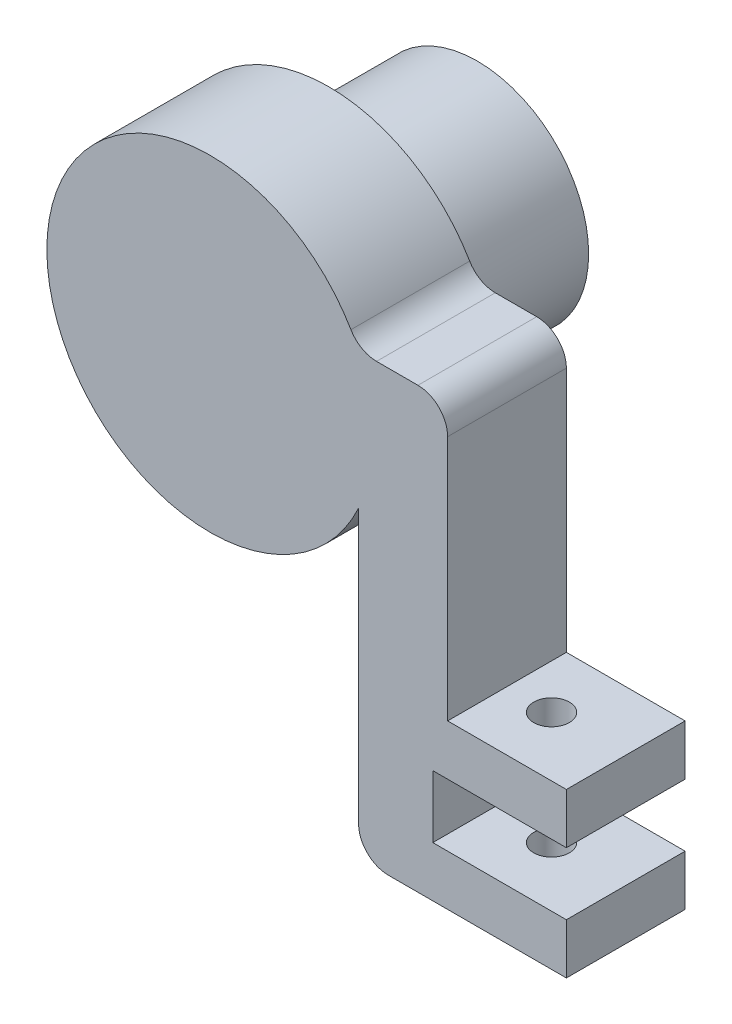
ISO-10303-21;
HEADER;
FILE_DESCRIPTION(('STEP AP214'),'2;1');
FILE_NAME('part.step','',(''),(''),'','','');
FILE_SCHEMA(('AUTOMOTIVE_DESIGN { 1 0 10303 214 1 1 1 1 }'));
ENDSEC;
DATA;
#1=APPLICATION_CONTEXT('core data for automotive mechanical design processes');
#2=APPLICATION_PROTOCOL_DEFINITION('international standard','automotive_design',2000,#1);
#3=PRODUCT_CONTEXT('',#1,'mechanical');
#4=PRODUCT('Part','Part','',(#3));
#5=PRODUCT_RELATED_PRODUCT_CATEGORY('part','',(#4));
#6=PRODUCT_DEFINITION_FORMATION('','',#4);
#7=PRODUCT_DEFINITION_CONTEXT('part definition',#1,'design');
#8=PRODUCT_DEFINITION('design','',#6,#7);
#9=PRODUCT_DEFINITION_SHAPE('','',#8);
#10=(LENGTH_UNIT() NAMED_UNIT(*) SI_UNIT(.MILLI.,.METRE.));
#11=(NAMED_UNIT(*) PLANE_ANGLE_UNIT() SI_UNIT($,.RADIAN.));
#12=(NAMED_UNIT(*) SI_UNIT($,.STERADIAN.) SOLID_ANGLE_UNIT());
#13=UNCERTAINTY_MEASURE_WITH_UNIT(LENGTH_MEASURE(1.E-05),#10,'distance_accuracy_value','');
#14=(GEOMETRIC_REPRESENTATION_CONTEXT(3) GLOBAL_UNCERTAINTY_ASSIGNED_CONTEXT((#13)) GLOBAL_UNIT_ASSIGNED_CONTEXT((#10,
#11,#12)) REPRESENTATION_CONTEXT('',''));
#15=CARTESIAN_POINT('',(0.,0.,0.));
#16=DIRECTION('',(0.,0.,1.));
#17=DIRECTION('',(1.,0.,0.));
#18=AXIS2_PLACEMENT_3D('',#15,#16,#17);
#19=CARTESIAN_POINT('',(35.,-36.,8.));
#20=DIRECTION('',(0.,1.,0.));
#21=DIRECTION('',(0.,0.,1.));
#22=AXIS2_PLACEMENT_3D('',#19,#20,#21);
#23=PLANE('',#22);
#24=DIRECTION('',(1.,0.,0.));
#25=VECTOR('',#24,1.);
#26=CARTESIAN_POINT('',(35.,-36.,8.));
#27=LINE('',#26,#25);
#28=CARTESIAN_POINT('',(23.,-36.,8.));
#29=VERTEX_POINT('',#28);
#30=CARTESIAN_POINT('',(35.,-36.,8.));
#31=VERTEX_POINT('',#30);
#32=EDGE_CURVE('E159',#29,#31,#27,.T.);
#33=ORIENTED_EDGE('',*,*,#32,.F.);
#34=DIRECTION('',(0.,0.,-1.));
#35=VECTOR('',#34,1.);
#36=CARTESIAN_POINT('',(23.,-36.,8.));
#37=LINE('',#36,#35);
#38=CARTESIAN_POINT('',(23.,-36.,0.));
#39=VERTEX_POINT('',#38);
#40=EDGE_CURVE('E170',#29,#39,#37,.T.);
#41=ORIENTED_EDGE('',*,*,#40,.T.);
#42=DIRECTION('',(1.,0.,0.));
#43=VECTOR('',#42,1.);
#44=CARTESIAN_POINT('',(35.,-36.,0.));
#45=LINE('',#44,#43);
#46=CARTESIAN_POINT('',(35.,-36.,0.));
#47=VERTEX_POINT('',#46);
#48=EDGE_CURVE('E164',#39,#47,#45,.T.);
#49=ORIENTED_EDGE('',*,*,#48,.T.);
#50=DIRECTION('',(0.,0.,-1.));
#51=VECTOR('',#50,1.);
#52=CARTESIAN_POINT('',(35.,-36.,8.));
#53=LINE('',#52,#51);
#54=EDGE_CURVE('E247',#31,#47,#53,.T.);
#55=ORIENTED_EDGE('',*,*,#54,.F.);
#56=EDGE_LOOP('',(#33,#41,#49,#55));
#57=FACE_BOUND('',#56,.T.);
#58=CARTESIAN_POINT('',(30.,-36.,4.));
#59=DIRECTION('',(0.,1.,0.));
#60=DIRECTION('',(0.,0.,1.));
#61=AXIS2_PLACEMENT_3D('',#58,#59,#60);
#62=CIRCLE('',#61,1.19999999999999);
#63=CARTESIAN_POINT('',(30.,-36.,5.19999999999999));
#64=VERTEX_POINT('',#63);
#65=EDGE_CURVE('E335',#64,#64,#62,.F.);
#66=ORIENTED_EDGE('',*,*,#65,.F.);
#67=EDGE_LOOP('',(#66));
#68=FACE_BOUND('',#67,.T.);
#69=ADVANCED_FACE('F39',(#57,#68),#23,.F.);
#70=CARTESIAN_POINT('',(35.,-36.,8.));
#71=DIRECTION('',(-1.,0.,0.));
#72=DIRECTION('',(0.,0.,1.));
#73=AXIS2_PLACEMENT_3D('',#70,#71,#72);
#74=PLANE('',#73);
#75=DIRECTION('',(0.,1.,0.));
#76=VECTOR('',#75,1.);
#77=CARTESIAN_POINT('',(35.,-36.,0.));
#78=LINE('',#77,#76);
#79=CARTESIAN_POINT('',(35.,-32.6,0.));
#80=VERTEX_POINT('',#79);
#81=EDGE_CURVE('E168',#47,#80,#78,.T.);
#82=ORIENTED_EDGE('',*,*,#81,.T.);
#83=DIRECTION('',(0.,0.,-1.));
#84=VECTOR('',#83,1.);
#85=CARTESIAN_POINT('',(35.,-32.6,8.));
#86=LINE('',#85,#84);
#87=CARTESIAN_POINT('',(35.,-32.6,8.));
#88=VERTEX_POINT('',#87);
#89=EDGE_CURVE('E146',#88,#80,#86,.T.);
#90=ORIENTED_EDGE('',*,*,#89,.F.);
#91=DIRECTION('',(0.,1.,0.));
#92=VECTOR('',#91,1.);
#93=CARTESIAN_POINT('',(35.,-36.,8.));
#94=LINE('',#93,#92);
#95=EDGE_CURVE('E153',#31,#88,#94,.T.);
#96=ORIENTED_EDGE('',*,*,#95,.F.);
#97=ORIENTED_EDGE('',*,*,#54,.T.);
#98=EDGE_LOOP('',(#82,#90,#96,#97));
#99=FACE_BOUND('',#98,.T.);
#100=ADVANCED_FACE('F166',(#99),#74,.F.);
#101=CARTESIAN_POINT('',(35.,-32.6,8.));
#102=DIRECTION('',(0.,-1.,0.));
#103=DIRECTION('',(1.,0.,0.));
#104=AXIS2_PLACEMENT_3D('',#101,#102,#103);
#105=PLANE('',#104);
#106=CARTESIAN_POINT('',(30.,-32.6,4.));
#107=DIRECTION('',(0.,-1.,0.));
#108=DIRECTION('',(1.,0.,0.));
#109=AXIS2_PLACEMENT_3D('',#106,#107,#108);
#110=CIRCLE('',#109,1.19999999999999);
#111=CARTESIAN_POINT('',(31.2,-32.6,4.));
#112=VERTEX_POINT('',#111);
#113=EDGE_CURVE('E251',#112,#112,#110,.T.);
#114=ORIENTED_EDGE('',*,*,#113,.T.);
#115=EDGE_LOOP('',(#114));
#116=FACE_BOUND('',#115,.T.);
#117=DIRECTION('',(-1.,0.,0.));
#118=VECTOR('',#117,1.);
#119=CARTESIAN_POINT('',(35.,-32.6,0.));
#120=LINE('',#119,#118);
#121=CARTESIAN_POINT('',(26.,-32.6,0.));
#122=VERTEX_POINT('',#121);
#123=EDGE_CURVE('E250',#80,#122,#120,.T.);
#124=ORIENTED_EDGE('',*,*,#123,.T.);
#125=DIRECTION('',(0.,0.,-1.));
#126=VECTOR('',#125,1.);
#127=CARTESIAN_POINT('',(26.,-32.6,8.));
#128=LINE('',#127,#126);
#129=CARTESIAN_POINT('',(26.,-32.6,8.));
#130=VERTEX_POINT('',#129);
#131=EDGE_CURVE('E149',#130,#122,#128,.T.);
#132=ORIENTED_EDGE('',*,*,#131,.F.);
#133=DIRECTION('',(-1.,0.,0.));
#134=VECTOR('',#133,1.);
#135=CARTESIAN_POINT('',(35.,-32.6,8.));
#136=LINE('',#135,#134);
#137=EDGE_CURVE('E142',#88,#130,#136,.T.);
#138=ORIENTED_EDGE('',*,*,#137,.F.);
#139=ORIENTED_EDGE('',*,*,#89,.T.);
#140=EDGE_LOOP('',(#124,#132,#138,#139));
#141=FACE_BOUND('',#140,.T.);
#142=ADVANCED_FACE('F144',(#116,#141),#105,.F.);
#143=CARTESIAN_POINT('',(26.,-32.6,8.));
#144=DIRECTION('',(-1.,0.,0.));
#145=DIRECTION('',(0.,0.,1.));
#146=AXIS2_PLACEMENT_3D('',#143,#144,#145);
#147=PLANE('',#146);
#148=DIRECTION('',(0.,1.,0.));
#149=VECTOR('',#148,1.);
#150=CARTESIAN_POINT('',(26.,-32.6,0.));
#151=LINE('',#150,#149);
#152=CARTESIAN_POINT('',(26.,-28.4,0.));
#153=VERTEX_POINT('',#152);
#154=EDGE_CURVE('E254',#122,#153,#151,.T.);
#155=ORIENTED_EDGE('',*,*,#154,.T.);
#156=DIRECTION('',(0.,0.,-1.));
#157=VECTOR('',#156,1.);
#158=CARTESIAN_POINT('',(26.,-28.4,8.));
#159=LINE('',#158,#157);
#160=CARTESIAN_POINT('',(26.,-28.4,8.));
#161=VERTEX_POINT('',#160);
#162=EDGE_CURVE('E177',#161,#153,#159,.T.);
#163=ORIENTED_EDGE('',*,*,#162,.F.);
#164=DIRECTION('',(0.,1.,0.));
#165=VECTOR('',#164,1.);
#166=CARTESIAN_POINT('',(26.,-32.6,8.));
#167=LINE('',#166,#165);
#168=EDGE_CURVE('E152',#130,#161,#167,.T.);
#169=ORIENTED_EDGE('',*,*,#168,.F.);
#170=ORIENTED_EDGE('',*,*,#131,.T.);
#171=EDGE_LOOP('',(#155,#163,#169,#170));
#172=FACE_BOUND('',#171,.T.);
#173=ADVANCED_FACE('F395',(#172),#147,.F.);
#174=CARTESIAN_POINT('',(35.,-28.4,8.));
#175=DIRECTION('',(0.,1.,0.));
#176=DIRECTION('',(-1.,0.,0.));
#177=AXIS2_PLACEMENT_3D('',#174,#175,#176);
#178=PLANE('',#177);
#179=CARTESIAN_POINT('',(30.,-28.4,4.));
#180=DIRECTION('',(0.,1.,0.));
#181=DIRECTION('',(-1.,0.,0.));
#182=AXIS2_PLACEMENT_3D('',#179,#180,#181);
#183=CIRCLE('',#182,1.19999999999999);
#184=CARTESIAN_POINT('',(28.8,-28.4,4.));
#185=VERTEX_POINT('',#184);
#186=EDGE_CURVE('E331',#185,#185,#183,.T.);
#187=ORIENTED_EDGE('',*,*,#186,.T.);
#188=EDGE_LOOP('',(#187));
#189=FACE_BOUND('',#188,.T.);
#190=DIRECTION('',(1.,0.,0.));
#191=VECTOR('',#190,1.);
#192=CARTESIAN_POINT('',(35.,-28.4,0.));
#193=LINE('',#192,#191);
#194=CARTESIAN_POINT('',(35.,-28.4,0.));
#195=VERTEX_POINT('',#194);
#196=EDGE_CURVE('E257',#153,#195,#193,.T.);
#197=ORIENTED_EDGE('',*,*,#196,.T.);
#198=DIRECTION('',(0.,0.,-1.));
#199=VECTOR('',#198,1.);
#200=CARTESIAN_POINT('',(35.,-28.4,8.));
#201=LINE('',#200,#199);
#202=CARTESIAN_POINT('',(35.,-28.4,8.));
#203=VERTEX_POINT('',#202);
#204=EDGE_CURVE('E289',#203,#195,#201,.T.);
#205=ORIENTED_EDGE('',*,*,#204,.F.);
#206=DIRECTION('',(1.,0.,0.));
#207=VECTOR('',#206,1.);
#208=CARTESIAN_POINT('',(35.,-28.4,8.));
#209=LINE('',#208,#207);
#210=EDGE_CURVE('E300',#161,#203,#209,.T.);
#211=ORIENTED_EDGE('',*,*,#210,.F.);
#212=ORIENTED_EDGE('',*,*,#162,.T.);
#213=EDGE_LOOP('',(#197,#205,#211,#212));
#214=FACE_BOUND('',#213,.T.);
#215=ADVANCED_FACE('F298',(#189,#214),#178,.F.);
#216=CARTESIAN_POINT('',(35.,-28.4,8.));
#217=DIRECTION('',(-1.,0.,0.));
#218=DIRECTION('',(0.,0.,1.));
#219=AXIS2_PLACEMENT_3D('',#216,#217,#218);
#220=PLANE('',#219);
#221=DIRECTION('',(0.,1.,0.));
#222=VECTOR('',#221,1.);
#223=CARTESIAN_POINT('',(35.,-28.4,0.));
#224=LINE('',#223,#222);
#225=CARTESIAN_POINT('',(35.,-25.,0.));
#226=VERTEX_POINT('',#225);
#227=EDGE_CURVE('E260',#195,#226,#224,.T.);
#228=ORIENTED_EDGE('',*,*,#227,.T.);
#229=DIRECTION('',(0.,0.,-1.));
#230=VECTOR('',#229,1.);
#231=CARTESIAN_POINT('',(35.,-25.,8.));
#232=LINE('',#231,#230);
#233=CARTESIAN_POINT('',(35.,-25.,8.));
#234=VERTEX_POINT('',#233);
#235=EDGE_CURVE('E285',#234,#226,#232,.T.);
#236=ORIENTED_EDGE('',*,*,#235,.F.);
#237=DIRECTION('',(0.,1.,0.));
#238=VECTOR('',#237,1.);
#239=CARTESIAN_POINT('',(35.,-28.4,8.));
#240=LINE('',#239,#238);
#241=EDGE_CURVE('E318',#203,#234,#240,.T.);
#242=ORIENTED_EDGE('',*,*,#241,.F.);
#243=ORIENTED_EDGE('',*,*,#204,.T.);
#244=EDGE_LOOP('',(#228,#236,#242,#243));
#245=FACE_BOUND('',#244,.T.);
#246=ADVANCED_FACE('F308',(#245),#220,.F.);
#247=CARTESIAN_POINT('',(35.,-25.,8.));
#248=DIRECTION('',(0.,-1.,0.));
#249=DIRECTION('',(0.,0.,-1.));
#250=AXIS2_PLACEMENT_3D('',#247,#248,#249);
#251=PLANE('',#250);
#252=CARTESIAN_POINT('',(30.,-25.,4.));
#253=DIRECTION('',(0.,1.,0.));
#254=DIRECTION('',(0.,0.,1.));
#255=AXIS2_PLACEMENT_3D('',#252,#253,#254);
#256=CIRCLE('',#255,1.19999999999999);
#257=CARTESIAN_POINT('',(30.,-25.,5.19999999999999));
#258=VERTEX_POINT('',#257);
#259=EDGE_CURVE('E336',#258,#258,#256,.T.);
#260=ORIENTED_EDGE('',*,*,#259,.F.);
#261=EDGE_LOOP('',(#260));
#262=FACE_BOUND('',#261,.T.);
#263=DIRECTION('',(-1.,0.,0.));
#264=VECTOR('',#263,1.);
#265=CARTESIAN_POINT('',(35.,-25.,0.));
#266=LINE('',#265,#264);
#267=CARTESIAN_POINT('',(27.,-25.,0.));
#268=VERTEX_POINT('',#267);
#269=EDGE_CURVE('E263',#226,#268,#266,.T.);
#270=ORIENTED_EDGE('',*,*,#269,.T.);
#271=DIRECTION('',(0.,0.,-1.));
#272=VECTOR('',#271,1.);
#273=CARTESIAN_POINT('',(27.,-25.,8.));
#274=LINE('',#273,#272);
#275=CARTESIAN_POINT('',(27.,-25.,8.));
#276=VERTEX_POINT('',#275);
#277=EDGE_CURVE('E281',#276,#268,#274,.T.);
#278=ORIENTED_EDGE('',*,*,#277,.F.);
#279=DIRECTION('',(-1.,0.,0.));
#280=VECTOR('',#279,1.);
#281=CARTESIAN_POINT('',(35.,-25.,8.));
#282=LINE('',#281,#280);
#283=EDGE_CURVE('E314',#234,#276,#282,.T.);
#284=ORIENTED_EDGE('',*,*,#283,.F.);
#285=ORIENTED_EDGE('',*,*,#235,.T.);
#286=EDGE_LOOP('',(#270,#278,#284,#285));
#287=FACE_BOUND('',#286,.T.);
#288=ADVANCED_FACE('F312',(#262,#287),#251,.F.);
#289=CARTESIAN_POINT('',(27.,-6.41742430504416,8.));
#290=DIRECTION('',(-1.,0.,0.));
#291=DIRECTION('',(0.,0.,1.));
#292=AXIS2_PLACEMENT_3D('',#289,#290,#291);
#293=PLANE('',#292);
#294=DIRECTION('',(0.,1.,0.));
#295=VECTOR('',#294,1.);
#296=CARTESIAN_POINT('',(27.,-6.41742430504416,0.));
#297=LINE('',#296,#295);
#298=CARTESIAN_POINT('',(27.,-8.41742430504416,0.));
#299=VERTEX_POINT('',#298);
#300=EDGE_CURVE('E224',#268,#299,#297,.T.);
#301=ORIENTED_EDGE('',*,*,#300,.T.);
#302=DIRECTION('',(0.,0.,-1.));
#303=VECTOR('',#302,1.);
#304=CARTESIAN_POINT('',(27.,-8.41742430504416,8.));
#305=LINE('',#304,#303);
#306=CARTESIAN_POINT('',(27.,-8.41742430504416,8.));
#307=VERTEX_POINT('',#306);
#308=EDGE_CURVE('E205',#299,#307,#305,.F.);
#309=ORIENTED_EDGE('',*,*,#308,.T.);
#310=DIRECTION('',(0.,1.,0.));
#311=VECTOR('',#310,1.);
#312=CARTESIAN_POINT('',(27.,-6.41742430504416,8.));
#313=LINE('',#312,#311);
#314=EDGE_CURVE('E241',#276,#307,#313,.T.);
#315=ORIENTED_EDGE('',*,*,#314,.F.);
#316=ORIENTED_EDGE('',*,*,#277,.T.);
#317=EDGE_LOOP('',(#301,#309,#315,#316));
#318=FACE_BOUND('',#317,.T.);
#319=ADVANCED_FACE('F384',(#318),#293,.F.);
#320=CARTESIAN_POINT('',(21.,-6.41742430504416,8.));
#321=DIRECTION('',(0.,-1.,0.));
#322=DIRECTION('',(0.,0.,-1.));
#323=AXIS2_PLACEMENT_3D('',#320,#321,#322);
#324=PLANE('',#323);
#325=DIRECTION('',(-1.,0.,0.));
#326=VECTOR('',#325,1.);
#327=CARTESIAN_POINT('',(21.,-6.41742430504416,0.));
#328=LINE('',#327,#326);
#329=CARTESIAN_POINT('',(25.,-6.41742430504416,0.));
#330=VERTEX_POINT('',#329);
#331=CARTESIAN_POINT('',(22.2102496502164,-6.41742430504416,0.));
#332=VERTEX_POINT('',#331);
#333=EDGE_CURVE('E216',#330,#332,#328,.T.);
#334=ORIENTED_EDGE('',*,*,#333,.T.);
#335=DIRECTION('',(0.,0.,1.));
#336=VECTOR('',#335,1.);
#337=CARTESIAN_POINT('',(22.2102496502164,-6.41742430504416,8.));
#338=LINE('',#337,#336);
#339=CARTESIAN_POINT('',(22.2102496502164,-6.41742430504416,8.));
#340=VERTEX_POINT('',#339);
#341=EDGE_CURVE('E62',#332,#340,#338,.T.);
#342=ORIENTED_EDGE('',*,*,#341,.T.);
#343=DIRECTION('',(-1.,0.,0.));
#344=VECTOR('',#343,1.);
#345=CARTESIAN_POINT('',(21.,-6.41742430504416,8.));
#346=LINE('',#345,#344);
#347=CARTESIAN_POINT('',(25.,-6.41742430504416,8.));
#348=VERTEX_POINT('',#347);
#349=EDGE_CURVE('E236',#348,#340,#346,.T.);
#350=ORIENTED_EDGE('',*,*,#349,.F.);
#351=DIRECTION('',(0.,0.,-1.));
#352=VECTOR('',#351,1.);
#353=CARTESIAN_POINT('',(25.,-6.41742430504416,8.));
#354=LINE('',#353,#352);
#355=EDGE_CURVE('E199',#348,#330,#354,.T.);
#356=ORIENTED_EDGE('',*,*,#355,.T.);
#357=EDGE_LOOP('',(#334,#342,#350,#356));
#358=FACE_BOUND('',#357,.T.);
#359=ADVANCED_FACE('F221',(#358),#324,.F.);
#360=CARTESIAN_POINT('',(11.,-11.,8.));
#361=DIRECTION('',(0.,0.,-1.));
#362=DIRECTION('',(-1.,0.,0.));
#363=AXIS2_PLACEMENT_3D('',#360,#361,#362);
#364=CYLINDRICAL_SURFACE('',#363,11.);
#365=CARTESIAN_POINT('',(11.,-11.,8.));
#366=DIRECTION('',(0.,0.,1.));
#367=DIRECTION('',(1.,0.,0.));
#368=AXIS2_PLACEMENT_3D('',#365,#366,#367);
#369=CIRCLE('',#368,11.);
#370=CARTESIAN_POINT('',(20.4855958578754,-5.43012825811429,8.));
#371=VERTEX_POINT('',#370);
#372=CARTESIAN_POINT('',(21.,-15.5825756949558,8.));
#373=VERTEX_POINT('',#372);
#374=EDGE_CURVE('E231',#371,#373,#369,.T.);
#375=ORIENTED_EDGE('',*,*,#374,.F.);
#376=DIRECTION('',(0.,0.,-1.));
#377=VECTOR('',#376,1.);
#378=CARTESIAN_POINT('',(20.4855958578754,-5.43012825811429,8.));
#379=LINE('',#378,#377);
#380=CARTESIAN_POINT('',(20.4855958578754,-5.43012825811429,0.));
#381=VERTEX_POINT('',#380);
#382=EDGE_CURVE('E195',#371,#381,#379,.T.);
#383=ORIENTED_EDGE('',*,*,#382,.T.);
#384=CARTESIAN_POINT('',(11.,-11.,0.));
#385=DIRECTION('',(0.,0.,1.));
#386=DIRECTION('',(1.,0.,0.));
#387=AXIS2_PLACEMENT_3D('',#384,#385,#386);
#388=CIRCLE('',#387,11.);
#389=CARTESIAN_POINT('',(21.,-15.5825756949558,0.));
#390=VERTEX_POINT('',#389);
#391=EDGE_CURVE('E218',#381,#390,#388,.T.);
#392=ORIENTED_EDGE('',*,*,#391,.T.);
#393=DIRECTION('',(0.,0.,-1.));
#394=VECTOR('',#393,1.);
#395=CARTESIAN_POINT('',(21.,-15.5825756949558,8.));
#396=LINE('',#395,#394);
#397=EDGE_CURVE('E232',#373,#390,#396,.T.);
#398=ORIENTED_EDGE('',*,*,#397,.F.);
#399=EDGE_LOOP('',(#375,#383,#392,#398));
#400=FACE_BOUND('',#399,.T.);
#401=ADVANCED_FACE('F228',(#400),#364,.T.);
#402=CARTESIAN_POINT('',(21.,-36.,8.));
#403=DIRECTION('',(1.,0.,0.));
#404=DIRECTION('',(0.,1.,0.));
#405=AXIS2_PLACEMENT_3D('',#402,#403,#404);
#406=PLANE('',#405);
#407=DIRECTION('',(0.,-1.,0.));
#408=VECTOR('',#407,1.);
#409=CARTESIAN_POINT('',(21.,-36.,0.));
#410=LINE('',#409,#408);
#411=CARTESIAN_POINT('',(21.,-34.,0.));
#412=VERTEX_POINT('',#411);
#413=EDGE_CURVE('E271',#390,#412,#410,.T.);
#414=ORIENTED_EDGE('',*,*,#413,.T.);
#415=DIRECTION('',(0.,0.,-1.));
#416=VECTOR('',#415,1.);
#417=CARTESIAN_POINT('',(21.,-34.,8.));
#418=LINE('',#417,#416);
#419=CARTESIAN_POINT('',(21.,-34.,8.));
#420=VERTEX_POINT('',#419);
#421=EDGE_CURVE('E186',#412,#420,#418,.F.);
#422=ORIENTED_EDGE('',*,*,#421,.T.);
#423=DIRECTION('',(0.,-1.,0.));
#424=VECTOR('',#423,1.);
#425=CARTESIAN_POINT('',(21.,-36.,8.));
#426=LINE('',#425,#424);
#427=EDGE_CURVE('E235',#373,#420,#426,.T.);
#428=ORIENTED_EDGE('',*,*,#427,.F.);
#429=ORIENTED_EDGE('',*,*,#397,.T.);
#430=EDGE_LOOP('',(#414,#422,#428,#429));
#431=FACE_BOUND('',#430,.T.);
#432=ADVANCED_FACE('F366',(#431),#406,.F.);
#433=CARTESIAN_POINT('',(11.,-11.,8.));
#434=DIRECTION('',(0.,0.,1.));
#435=DIRECTION('',(1.,0.,0.));
#436=AXIS2_PLACEMENT_3D('',#433,#434,#435);
#437=PLANE('',#436);
#438=ORIENTED_EDGE('',*,*,#427,.T.);
#439=CARTESIAN_POINT('',(23.,-34.,8.));
#440=DIRECTION('',(0.,0.,1.));
#441=DIRECTION('',(1.,0.,0.));
#442=AXIS2_PLACEMENT_3D('',#439,#440,#441);
#443=CIRCLE('',#442,2.);
#444=EDGE_CURVE('E192',#420,#29,#443,.T.);
#445=ORIENTED_EDGE('',*,*,#444,.T.);
#446=ORIENTED_EDGE('',*,*,#32,.T.);
#447=ORIENTED_EDGE('',*,*,#95,.T.);
#448=ORIENTED_EDGE('',*,*,#137,.T.);
#449=ORIENTED_EDGE('',*,*,#168,.T.);
#450=ORIENTED_EDGE('',*,*,#210,.T.);
#451=ORIENTED_EDGE('',*,*,#241,.T.);
#452=ORIENTED_EDGE('',*,*,#283,.T.);
#453=ORIENTED_EDGE('',*,*,#314,.T.);
#454=CARTESIAN_POINT('',(25.,-8.41742430504416,8.));
#455=DIRECTION('',(0.,0.,1.));
#456=DIRECTION('',(1.,0.,0.));
#457=AXIS2_PLACEMENT_3D('',#454,#455,#456);
#458=CIRCLE('',#457,2.);
#459=EDGE_CURVE('E189',#307,#348,#458,.T.);
#460=ORIENTED_EDGE('',*,*,#459,.T.);
#461=ORIENTED_EDGE('',*,*,#349,.T.);
#462=CARTESIAN_POINT('',(22.2102496502164,-4.41742430504416,8.));
#463=DIRECTION('',(0.,0.,1.));
#464=DIRECTION('',(1.,0.,0.));
#465=AXIS2_PLACEMENT_3D('',#462,#463,#464);
#466=CIRCLE('',#465,2.);
#467=EDGE_CURVE('E48',#340,#371,#466,.F.);
#468=ORIENTED_EDGE('',*,*,#467,.T.);
#469=ORIENTED_EDGE('',*,*,#374,.T.);
#470=EDGE_LOOP('',(#438,#445,#446,#447,#448,#449,#450,#451,#452,#453,#460,#461,#468,#469));
#471=FACE_BOUND('',#470,.T.);
#472=ADVANCED_FACE('F157',(#471),#437,.T.);
#473=CARTESIAN_POINT('',(11.,-11.,0.));
#474=DIRECTION('',(0.,0.,1.));
#475=DIRECTION('',(1.,0.,0.));
#476=AXIS2_PLACEMENT_3D('',#473,#474,#475);
#477=PLANE('',#476);
#478=CARTESIAN_POINT('',(11.,-11.,0.));
#479=DIRECTION('',(0.,0.,1.));
#480=DIRECTION('',(1.,0.,0.));
#481=AXIS2_PLACEMENT_3D('',#478,#479,#480);
#482=CIRCLE('',#481,7.5);
#483=CARTESIAN_POINT('',(18.5,-11.,0.));
#484=VERTEX_POINT('',#483);
#485=EDGE_CURVE('E11',#484,#484,#482,.F.);
#486=ORIENTED_EDGE('',*,*,#485,.F.);
#487=EDGE_LOOP('',(#486));
#488=FACE_BOUND('',#487,.T.);
#489=ORIENTED_EDGE('',*,*,#48,.F.);
#490=CARTESIAN_POINT('',(23.,-34.,0.));
#491=DIRECTION('',(0.,0.,1.));
#492=DIRECTION('',(1.,0.,0.));
#493=AXIS2_PLACEMENT_3D('',#490,#491,#492);
#494=CIRCLE('',#493,2.);
#495=EDGE_CURVE('E183',#39,#412,#494,.F.);
#496=ORIENTED_EDGE('',*,*,#495,.T.);
#497=ORIENTED_EDGE('',*,*,#413,.F.);
#498=ORIENTED_EDGE('',*,*,#391,.F.);
#499=CARTESIAN_POINT('',(22.2102496502164,-4.41742430504416,0.));
#500=DIRECTION('',(0.,0.,1.));
#501=DIRECTION('',(1.,0.,0.));
#502=AXIS2_PLACEMENT_3D('',#499,#500,#501);
#503=CIRCLE('',#502,2.);
#504=EDGE_CURVE('E208',#381,#332,#503,.T.);
#505=ORIENTED_EDGE('',*,*,#504,.T.);
#506=ORIENTED_EDGE('',*,*,#333,.F.);
#507=CARTESIAN_POINT('',(25.,-8.41742430504416,0.));
#508=DIRECTION('',(0.,0.,1.));
#509=DIRECTION('',(1.,0.,0.));
#510=AXIS2_PLACEMENT_3D('',#507,#508,#509);
#511=CIRCLE('',#510,2.);
#512=EDGE_CURVE('E175',#330,#299,#511,.F.);
#513=ORIENTED_EDGE('',*,*,#512,.T.);
#514=ORIENTED_EDGE('',*,*,#300,.F.);
#515=ORIENTED_EDGE('',*,*,#269,.F.);
#516=ORIENTED_EDGE('',*,*,#227,.F.);
#517=ORIENTED_EDGE('',*,*,#196,.F.);
#518=ORIENTED_EDGE('',*,*,#154,.F.);
#519=ORIENTED_EDGE('',*,*,#123,.F.);
#520=ORIENTED_EDGE('',*,*,#81,.F.);
#521=EDGE_LOOP('',(#489,#496,#497,#498,#505,#506,#513,#514,#515,#516,#517,#518,#519,#520));
#522=FACE_BOUND('',#521,.T.);
#523=ADVANCED_FACE('F215',(#488,#522),#477,.F.);
#524=CARTESIAN_POINT('',(30.,-25.,4.));
#525=DIRECTION('',(0.,1.,0.));
#526=DIRECTION('',(0.,0.,1.));
#527=AXIS2_PLACEMENT_3D('',#524,#525,#526);
#528=CYLINDRICAL_SURFACE('',#527,1.19999999999999);
#529=ORIENTED_EDGE('',*,*,#259,.T.);
#530=EDGE_LOOP('',(#529));
#531=FACE_BOUND('',#530,.T.);
#532=ORIENTED_EDGE('',*,*,#186,.F.);
#533=EDGE_LOOP('',(#532));
#534=FACE_BOUND('',#533,.T.);
#535=ADVANCED_FACE('F357',(#531,#534),#528,.F.);
#536=ORIENTED_EDGE('',*,*,#65,.T.);
#537=EDGE_LOOP('',(#536));
#538=FACE_BOUND('',#537,.T.);
#539=ORIENTED_EDGE('',*,*,#113,.F.);
#540=EDGE_LOOP('',(#539));
#541=FACE_BOUND('',#540,.T.);
#542=ADVANCED_FACE('F363',(#538,#541),#528,.F.);
#543=CARTESIAN_POINT('',(23.,-34.,8.));
#544=DIRECTION('',(0.,0.,-1.));
#545=DIRECTION('',(-1.,0.,0.));
#546=AXIS2_PLACEMENT_3D('',#543,#544,#545);
#547=CYLINDRICAL_SURFACE('',#546,2.);
#548=ORIENTED_EDGE('',*,*,#444,.F.);
#549=ORIENTED_EDGE('',*,*,#421,.F.);
#550=ORIENTED_EDGE('',*,*,#495,.F.);
#551=ORIENTED_EDGE('',*,*,#40,.F.);
#552=EDGE_LOOP('',(#548,#549,#550,#551));
#553=FACE_BOUND('',#552,.T.);
#554=ADVANCED_FACE('F402',(#553),#547,.T.);
#555=CARTESIAN_POINT('',(22.2102496502164,-4.41742430504416,8.));
#556=DIRECTION('',(0.,0.,-1.));
#557=DIRECTION('',(-1.,0.,0.));
#558=AXIS2_PLACEMENT_3D('',#555,#556,#557);
#559=CYLINDRICAL_SURFACE('',#558,2.);
#560=ORIENTED_EDGE('',*,*,#467,.F.);
#561=ORIENTED_EDGE('',*,*,#341,.F.);
#562=ORIENTED_EDGE('',*,*,#504,.F.);
#563=ORIENTED_EDGE('',*,*,#382,.F.);
#564=EDGE_LOOP('',(#560,#561,#562,#563));
#565=FACE_BOUND('',#564,.T.);
#566=ADVANCED_FACE('F226',(#565),#559,.F.);
#567=CARTESIAN_POINT('',(25.,-8.41742430504416,8.));
#568=DIRECTION('',(0.,0.,-1.));
#569=DIRECTION('',(-1.,0.,0.));
#570=AXIS2_PLACEMENT_3D('',#567,#568,#569);
#571=CYLINDRICAL_SURFACE('',#570,2.);
#572=ORIENTED_EDGE('',*,*,#459,.F.);
#573=ORIENTED_EDGE('',*,*,#308,.F.);
#574=ORIENTED_EDGE('',*,*,#512,.F.);
#575=ORIENTED_EDGE('',*,*,#355,.F.);
#576=EDGE_LOOP('',(#572,#573,#574,#575));
#577=FACE_BOUND('',#576,.T.);
#578=ADVANCED_FACE('F41',(#577),#571,.T.);
#579=CARTESIAN_POINT('',(11.,-11.,-10.));
#580=DIRECTION('',(0.,0.,1.));
#581=DIRECTION('',(1.,0.,0.));
#582=AXIS2_PLACEMENT_3D('',#579,#580,#581);
#583=CYLINDRICAL_SURFACE('',#582,7.5);
#584=CARTESIAN_POINT('',(11.,-11.,-10.));
#585=DIRECTION('',(0.,0.,-1.));
#586=DIRECTION('',(-1.,0.,0.));
#587=AXIS2_PLACEMENT_3D('',#584,#585,#586);
#588=CIRCLE('',#587,7.5);
#589=CARTESIAN_POINT('',(3.5,-11.,-10.));
#590=VERTEX_POINT('',#589);
#591=EDGE_CURVE('E340',#590,#590,#588,.T.);
#592=ORIENTED_EDGE('',*,*,#591,.F.);
#593=EDGE_LOOP('',(#592));
#594=FACE_BOUND('',#593,.T.);
#595=ORIENTED_EDGE('',*,*,#485,.T.);
#596=EDGE_LOOP('',(#595));
#597=FACE_BOUND('',#596,.T.);
#598=ADVANCED_FACE('F350',(#594,#597),#583,.T.);
#599=CARTESIAN_POINT('',(11.,-11.,-10.));
#600=DIRECTION('',(0.,0.,-1.));
#601=DIRECTION('',(-1.,0.,0.));
#602=AXIS2_PLACEMENT_3D('',#599,#600,#601);
#603=PLANE('',#602);
#604=ORIENTED_EDGE('',*,*,#591,.T.);
#605=EDGE_LOOP('',(#604));
#606=FACE_BOUND('',#605,.T.);
#607=ADVANCED_FACE('F348',(#606),#603,.T.);
#608=CLOSED_SHELL('',(#69,#100,#142,#173,#215,#246,#288,#319,#359,#401,#432,#472,#523,#535,#542,
#554,#566,#578,#598,#607));
#609=MANIFOLD_SOLID_BREP('B2',#608);
#610=ADVANCED_BREP_SHAPE_REPRESENTATION('',(#18,#609),#14);
#611=SHAPE_DEFINITION_REPRESENTATION(#9,#610);
ENDSEC;
END-ISO-10303-21;
